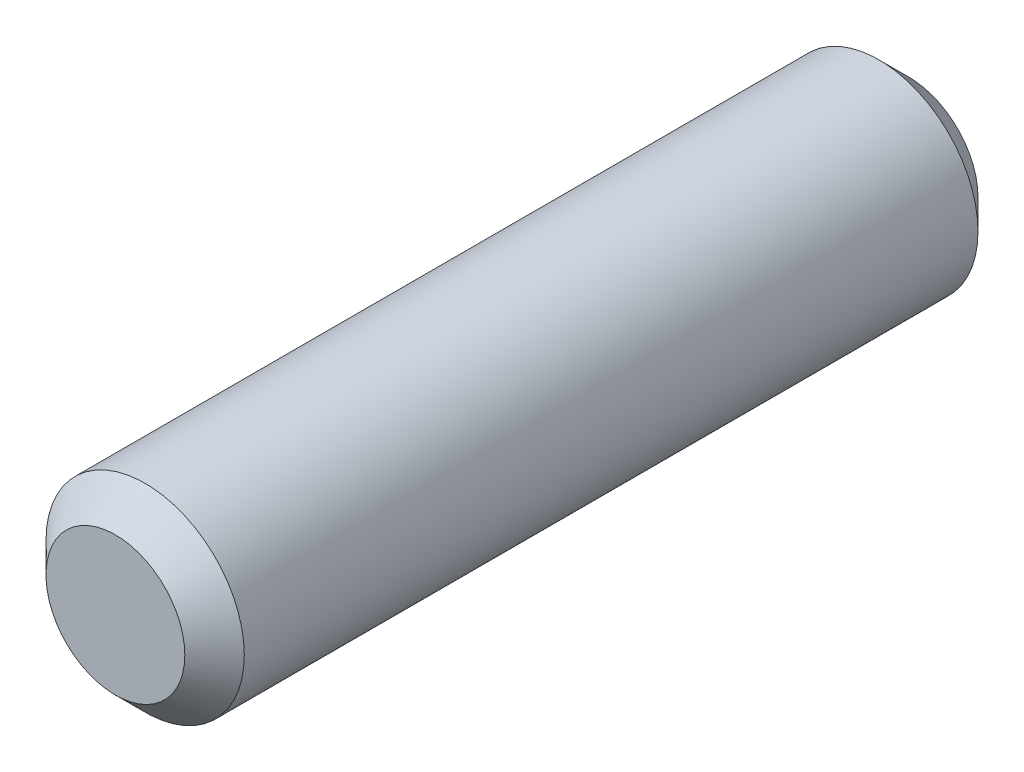
ISO-10303-21;
HEADER;
FILE_DESCRIPTION(('STEP AP214'),'2;1');
FILE_NAME('part.step','',(''),(''),'','','');
FILE_SCHEMA(('AUTOMOTIVE_DESIGN { 1 0 10303 214 1 1 1 1 }'));
ENDSEC;
DATA;
#1=APPLICATION_CONTEXT('core data for automotive mechanical design processes');
#2=APPLICATION_PROTOCOL_DEFINITION('international standard','automotive_design',2000,#1);
#3=PRODUCT_CONTEXT('',#1,'mechanical');
#4=PRODUCT('Part','Part','',(#3));
#5=PRODUCT_RELATED_PRODUCT_CATEGORY('part','',(#4));
#6=PRODUCT_DEFINITION_FORMATION('','',#4);
#7=PRODUCT_DEFINITION_CONTEXT('part definition',#1,'design');
#8=PRODUCT_DEFINITION('design','',#6,#7);
#9=PRODUCT_DEFINITION_SHAPE('','',#8);
#10=(LENGTH_UNIT() NAMED_UNIT(*) SI_UNIT(.MILLI.,.METRE.));
#11=(NAMED_UNIT(*) PLANE_ANGLE_UNIT() SI_UNIT($,.RADIAN.));
#12=(NAMED_UNIT(*) SI_UNIT($,.STERADIAN.) SOLID_ANGLE_UNIT());
#13=UNCERTAINTY_MEASURE_WITH_UNIT(LENGTH_MEASURE(1.E-05),#10,'distance_accuracy_value','');
#14=(GEOMETRIC_REPRESENTATION_CONTEXT(3) GLOBAL_UNCERTAINTY_ASSIGNED_CONTEXT((#13)) GLOBAL_UNIT_ASSIGNED_CONTEXT((#10,
#11,#12)) REPRESENTATION_CONTEXT('',''));
#15=CARTESIAN_POINT('',(0.,0.,0.));
#16=DIRECTION('',(0.,0.,1.));
#17=DIRECTION('',(1.,0.,0.));
#18=AXIS2_PLACEMENT_3D('',#15,#16,#17);
#19=CARTESIAN_POINT('',(0.,0.,20.));
#20=DIRECTION('',(0.,0.,-1.));
#21=DIRECTION('',(-1.,0.,0.));
#22=AXIS2_PLACEMENT_3D('',#19,#20,#21);
#23=CYLINDRICAL_SURFACE('',#22,2.5);
#24=CARTESIAN_POINT('',(0.,0.,19.25));
#25=DIRECTION('',(0.,0.,1.));
#26=DIRECTION('',(1.,0.,0.));
#27=AXIS2_PLACEMENT_3D('',#24,#25,#26);
#28=CIRCLE('',#27,2.5);
#29=CARTESIAN_POINT('',(2.5,0.,19.25));
#30=VERTEX_POINT('',#29);
#31=EDGE_CURVE('E48',#30,#30,#28,.F.);
#32=ORIENTED_EDGE('',*,*,#31,.T.);
#33=EDGE_LOOP('',(#32));
#34=FACE_BOUND('',#33,.T.);
#35=CARTESIAN_POINT('',(0.,0.,0.749999999999997));
#36=DIRECTION('',(0.,0.,1.));
#37=DIRECTION('',(1.,0.,0.));
#38=AXIS2_PLACEMENT_3D('',#35,#36,#37);
#39=CIRCLE('',#38,2.5);
#40=CARTESIAN_POINT('',(2.5,0.,0.749999999999997));
#41=VERTEX_POINT('',#40);
#42=EDGE_CURVE('E52',#41,#41,#39,.T.);
#43=ORIENTED_EDGE('',*,*,#42,.T.);
#44=EDGE_LOOP('',(#43));
#45=FACE_BOUND('',#44,.T.);
#46=ADVANCED_FACE('F40',(#34,#45),#23,.T.);
#47=CARTESIAN_POINT('',(0.,0.,20.));
#48=DIRECTION('',(0.,0.,1.));
#49=DIRECTION('',(1.,0.,0.));
#50=AXIS2_PLACEMENT_3D('',#47,#48,#49);
#51=PLANE('',#50);
#52=CARTESIAN_POINT('',(0.,0.,20.));
#53=DIRECTION('',(0.,0.,1.));
#54=DIRECTION('',(1.,0.,0.));
#55=AXIS2_PLACEMENT_3D('',#52,#53,#54);
#56=CIRCLE('',#55,1.75);
#57=CARTESIAN_POINT('',(1.75,0.,20.));
#58=VERTEX_POINT('',#57);
#59=EDGE_CURVE('E56',#58,#58,#56,.T.);
#60=ORIENTED_EDGE('',*,*,#59,.T.);
#61=EDGE_LOOP('',(#60));
#62=FACE_BOUND('',#61,.T.);
#63=ADVANCED_FACE('F62',(#62),#51,.T.);
#64=CARTESIAN_POINT('',(0.,0.,0.));
#65=DIRECTION('',(0.,0.,1.));
#66=DIRECTION('',(1.,0.,0.));
#67=AXIS2_PLACEMENT_3D('',#64,#65,#66);
#68=PLANE('',#67);
#69=CARTESIAN_POINT('',(0.,0.,0.));
#70=DIRECTION('',(0.,0.,1.));
#71=DIRECTION('',(1.,0.,0.));
#72=AXIS2_PLACEMENT_3D('',#69,#70,#71);
#73=CIRCLE('',#72,1.75);
#74=CARTESIAN_POINT('',(1.75,0.,0.));
#75=VERTEX_POINT('',#74);
#76=EDGE_CURVE('E10',#75,#75,#73,.F.);
#77=ORIENTED_EDGE('',*,*,#76,.T.);
#78=EDGE_LOOP('',(#77));
#79=FACE_BOUND('',#78,.T.);
#80=ADVANCED_FACE('F66',(#79),#68,.F.);
#81=CARTESIAN_POINT('',(0.,0.,20.));
#82=DIRECTION('',(0.,0.,-1.));
#83=DIRECTION('',(-1.,0.,0.));
#84=AXIS2_PLACEMENT_3D('',#81,#82,#83);
#85=CONICAL_SURFACE('',#84,1.75,0.785398163397449);
#86=ORIENTED_EDGE('',*,*,#31,.F.);
#87=EDGE_LOOP('',(#86));
#88=FACE_BOUND('',#87,.T.);
#89=ORIENTED_EDGE('',*,*,#59,.F.);
#90=EDGE_LOOP('',(#89));
#91=FACE_BOUND('',#90,.T.);
#92=ADVANCED_FACE('F64',(#88,#91),#85,.T.);
#93=CARTESIAN_POINT('',(0.,0.,0.749999999999997));
#94=DIRECTION('',(0.,0.,1.));
#95=DIRECTION('',(1.,0.,0.));
#96=AXIS2_PLACEMENT_3D('',#93,#94,#95);
#97=CONICAL_SURFACE('',#96,2.5,0.785398163397449);
#98=ORIENTED_EDGE('',*,*,#76,.F.);
#99=EDGE_LOOP('',(#98));
#100=FACE_BOUND('',#99,.T.);
#101=ORIENTED_EDGE('',*,*,#42,.F.);
#102=EDGE_LOOP('',(#101));
#103=FACE_BOUND('',#102,.T.);
#104=ADVANCED_FACE('F43',(#100,#103),#97,.T.);
#105=CLOSED_SHELL('',(#46,#63,#80,#92,#104));
#106=MANIFOLD_SOLID_BREP('B2',#105);
#107=ADVANCED_BREP_SHAPE_REPRESENTATION('',(#18,#106),#14);
#108=SHAPE_DEFINITION_REPRESENTATION(#9,#107);
ENDSEC;
END-ISO-10303-21;
